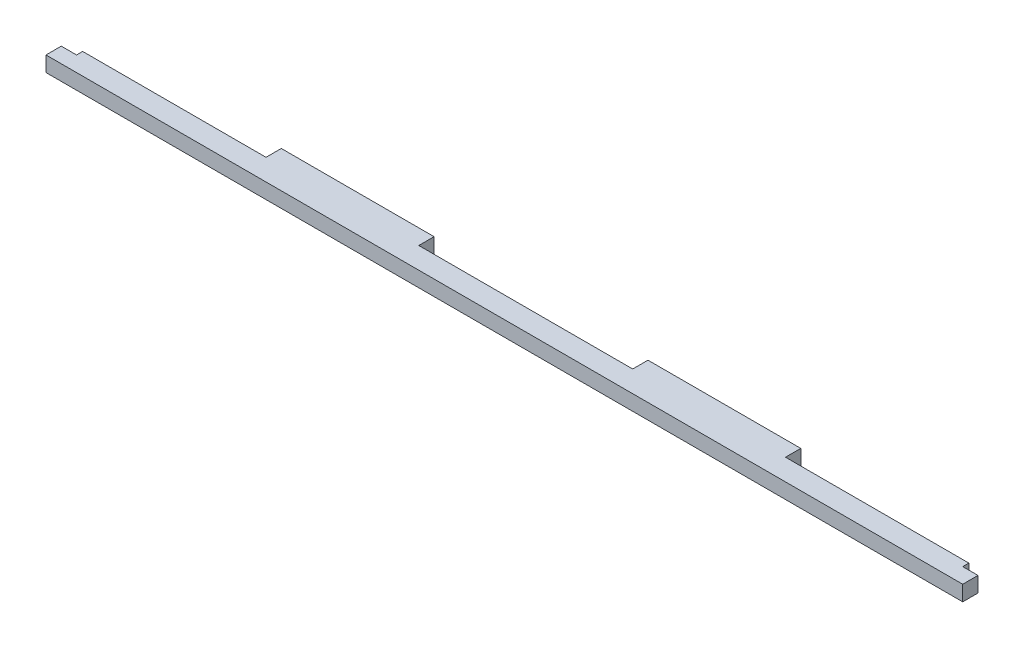
ISO-10303-21;
HEADER;
FILE_DESCRIPTION(('STEP AP214'),'2;1');
FILE_NAME('part.step','',(''),(''),'','','');
FILE_SCHEMA(('AUTOMOTIVE_DESIGN { 1 0 10303 214 1 1 1 1 }'));
ENDSEC;
DATA;
#1=APPLICATION_CONTEXT('core data for automotive mechanical design processes');
#2=APPLICATION_PROTOCOL_DEFINITION('international standard','automotive_design',2000,#1);
#3=PRODUCT_CONTEXT('',#1,'mechanical');
#4=PRODUCT('Part','Part','',(#3));
#5=PRODUCT_RELATED_PRODUCT_CATEGORY('part','',(#4));
#6=PRODUCT_DEFINITION_FORMATION('','',#4);
#7=PRODUCT_DEFINITION_CONTEXT('part definition',#1,'design');
#8=PRODUCT_DEFINITION('design','',#6,#7);
#9=PRODUCT_DEFINITION_SHAPE('','',#8);
#10=(LENGTH_UNIT() NAMED_UNIT(*) SI_UNIT(.MILLI.,.METRE.));
#11=(NAMED_UNIT(*) PLANE_ANGLE_UNIT() SI_UNIT($,.RADIAN.));
#12=(NAMED_UNIT(*) SI_UNIT($,.STERADIAN.) SOLID_ANGLE_UNIT());
#13=UNCERTAINTY_MEASURE_WITH_UNIT(LENGTH_MEASURE(1.E-05),#10,'distance_accuracy_value','');
#14=(GEOMETRIC_REPRESENTATION_CONTEXT(3) GLOBAL_UNCERTAINTY_ASSIGNED_CONTEXT((#13)) GLOBAL_UNIT_ASSIGNED_CONTEXT((#10,
#11,#12)) REPRESENTATION_CONTEXT('',''));
#15=CARTESIAN_POINT('',(0.,0.,0.));
#16=DIRECTION('',(0.,0.,1.));
#17=DIRECTION('',(1.,0.,0.));
#18=AXIS2_PLACEMENT_3D('',#15,#16,#17);
#19=CARTESIAN_POINT('',(0.,5.,0.));
#20=DIRECTION('',(1.,0.,0.));
#21=DIRECTION('',(0.,0.,-1.));
#22=AXIS2_PLACEMENT_3D('',#19,#20,#21);
#23=PLANE('',#22);
#24=DIRECTION('',(0.,0.,1.));
#25=VECTOR('',#24,1.);
#26=CARTESIAN_POINT('',(0.,0.,0.));
#27=LINE('',#26,#25);
#28=CARTESIAN_POINT('',(0.,0.,-5.));
#29=VERTEX_POINT('',#28);
#30=CARTESIAN_POINT('',(0.,0.,0.));
#31=VERTEX_POINT('',#30);
#32=EDGE_CURVE('E181',#29,#31,#27,.T.);
#33=ORIENTED_EDGE('',*,*,#32,.T.);
#34=DIRECTION('',(0.,-1.,0.));
#35=VECTOR('',#34,1.);
#36=CARTESIAN_POINT('',(0.,5.,0.));
#37=LINE('',#36,#35);
#38=CARTESIAN_POINT('',(0.,5.,0.));
#39=VERTEX_POINT('',#38);
#40=EDGE_CURVE('E11',#39,#31,#37,.T.);
#41=ORIENTED_EDGE('',*,*,#40,.F.);
#42=DIRECTION('',(0.,0.,1.));
#43=VECTOR('',#42,1.);
#44=CARTESIAN_POINT('',(0.,5.,0.));
#45=LINE('',#44,#43);
#46=CARTESIAN_POINT('',(0.,5.,-5.));
#47=VERTEX_POINT('',#46);
#48=EDGE_CURVE('E211',#47,#39,#45,.T.);
#49=ORIENTED_EDGE('',*,*,#48,.F.);
#50=DIRECTION('',(0.,-1.,0.));
#51=VECTOR('',#50,1.);
#52=CARTESIAN_POINT('',(0.,5.,-5.));
#53=LINE('',#52,#51);
#54=EDGE_CURVE('E177',#47,#29,#53,.T.);
#55=ORIENTED_EDGE('',*,*,#54,.T.);
#56=EDGE_LOOP('',(#33,#41,#49,#55));
#57=FACE_BOUND('',#56,.T.);
#58=ADVANCED_FACE('F37',(#57),#23,.F.);
#59=CARTESIAN_POINT('',(0.,5.,0.));
#60=DIRECTION('',(0.,0.,-1.));
#61=DIRECTION('',(-1.,0.,0.));
#62=AXIS2_PLACEMENT_3D('',#59,#60,#61);
#63=PLANE('',#62);
#64=DIRECTION('',(1.,0.,0.));
#65=VECTOR('',#64,1.);
#66=CARTESIAN_POINT('',(0.,0.,0.));
#67=LINE('',#66,#65);
#68=CARTESIAN_POINT('',(300.,0.,0.));
#69=VERTEX_POINT('',#68);
#70=EDGE_CURVE('E184',#31,#69,#67,.T.);
#71=ORIENTED_EDGE('',*,*,#70,.T.);
#72=DIRECTION('',(0.,-1.,0.));
#73=VECTOR('',#72,1.);
#74=CARTESIAN_POINT('',(300.,5.,0.));
#75=LINE('',#74,#73);
#76=CARTESIAN_POINT('',(300.,5.,0.));
#77=VERTEX_POINT('',#76);
#78=EDGE_CURVE('E45',#77,#69,#75,.T.);
#79=ORIENTED_EDGE('',*,*,#78,.F.);
#80=DIRECTION('',(1.,0.,0.));
#81=VECTOR('',#80,1.);
#82=CARTESIAN_POINT('',(0.,5.,0.));
#83=LINE('',#82,#81);
#84=EDGE_CURVE('E120',#39,#77,#83,.T.);
#85=ORIENTED_EDGE('',*,*,#84,.F.);
#86=ORIENTED_EDGE('',*,*,#40,.T.);
#87=EDGE_LOOP('',(#71,#79,#85,#86));
#88=FACE_BOUND('',#87,.T.);
#89=ADVANCED_FACE('F309',(#88),#63,.F.);
#90=CARTESIAN_POINT('',(300.,5.,0.));
#91=DIRECTION('',(-1.,0.,0.));
#92=DIRECTION('',(0.,0.,1.));
#93=AXIS2_PLACEMENT_3D('',#90,#91,#92);
#94=PLANE('',#93);
#95=DIRECTION('',(0.,0.,-1.));
#96=VECTOR('',#95,1.);
#97=CARTESIAN_POINT('',(300.,0.,0.));
#98=LINE('',#97,#96);
#99=CARTESIAN_POINT('',(300.,0.,-5.));
#100=VERTEX_POINT('',#99);
#101=EDGE_CURVE('E186',#69,#100,#98,.T.);
#102=ORIENTED_EDGE('',*,*,#101,.T.);
#103=DIRECTION('',(0.,-1.,0.));
#104=VECTOR('',#103,1.);
#105=CARTESIAN_POINT('',(300.,5.,-5.));
#106=LINE('',#105,#104);
#107=CARTESIAN_POINT('',(300.,5.,-5.));
#108=VERTEX_POINT('',#107);
#109=EDGE_CURVE('E242',#108,#100,#106,.T.);
#110=ORIENTED_EDGE('',*,*,#109,.F.);
#111=DIRECTION('',(0.,0.,-1.));
#112=VECTOR('',#111,1.);
#113=CARTESIAN_POINT('',(300.,5.,0.));
#114=LINE('',#113,#112);
#115=EDGE_CURVE('E250',#77,#108,#114,.T.);
#116=ORIENTED_EDGE('',*,*,#115,.F.);
#117=ORIENTED_EDGE('',*,*,#78,.T.);
#118=EDGE_LOOP('',(#102,#110,#116,#117));
#119=FACE_BOUND('',#118,.T.);
#120=ADVANCED_FACE('F248',(#119),#94,.F.);
#121=CARTESIAN_POINT('',(295.,5.,-5.));
#122=DIRECTION('',(0.,0.,1.));
#123=DIRECTION('',(1.,0.,0.));
#124=AXIS2_PLACEMENT_3D('',#121,#122,#123);
#125=PLANE('',#124);
#126=DIRECTION('',(-1.,0.,0.));
#127=VECTOR('',#126,1.);
#128=CARTESIAN_POINT('',(295.,0.,-5.));
#129=LINE('',#128,#127);
#130=CARTESIAN_POINT('',(295.,0.,-5.));
#131=VERTEX_POINT('',#130);
#132=EDGE_CURVE('E188',#100,#131,#129,.T.);
#133=ORIENTED_EDGE('',*,*,#132,.T.);
#134=DIRECTION('',(0.,-1.,0.));
#135=VECTOR('',#134,1.);
#136=CARTESIAN_POINT('',(295.,5.,-5.));
#137=LINE('',#136,#135);
#138=CARTESIAN_POINT('',(295.,5.,-5.));
#139=VERTEX_POINT('',#138);
#140=EDGE_CURVE('E239',#139,#131,#137,.T.);
#141=ORIENTED_EDGE('',*,*,#140,.F.);
#142=DIRECTION('',(-1.,0.,0.));
#143=VECTOR('',#142,1.);
#144=CARTESIAN_POINT('',(295.,5.,-5.));
#145=LINE('',#144,#143);
#146=EDGE_CURVE('E268',#108,#139,#145,.T.);
#147=ORIENTED_EDGE('',*,*,#146,.F.);
#148=ORIENTED_EDGE('',*,*,#109,.T.);
#149=EDGE_LOOP('',(#133,#141,#147,#148));
#150=FACE_BOUND('',#149,.T.);
#151=ADVANCED_FACE('F259',(#150),#125,.F.);
#152=CARTESIAN_POINT('',(295.,5.,-7.));
#153=DIRECTION('',(-1.,0.,0.));
#154=DIRECTION('',(0.,0.,1.));
#155=AXIS2_PLACEMENT_3D('',#152,#153,#154);
#156=PLANE('',#155);
#157=DIRECTION('',(0.,0.,-1.));
#158=VECTOR('',#157,1.);
#159=CARTESIAN_POINT('',(295.,0.,-7.));
#160=LINE('',#159,#158);
#161=CARTESIAN_POINT('',(295.,0.,-7.));
#162=VERTEX_POINT('',#161);
#163=EDGE_CURVE('E190',#131,#162,#160,.T.);
#164=ORIENTED_EDGE('',*,*,#163,.T.);
#165=DIRECTION('',(0.,-1.,0.));
#166=VECTOR('',#165,1.);
#167=CARTESIAN_POINT('',(295.,5.,-7.));
#168=LINE('',#167,#166);
#169=CARTESIAN_POINT('',(295.,5.,-7.));
#170=VERTEX_POINT('',#169);
#171=EDGE_CURVE('E236',#170,#162,#168,.T.);
#172=ORIENTED_EDGE('',*,*,#171,.F.);
#173=DIRECTION('',(0.,0.,-1.));
#174=VECTOR('',#173,1.);
#175=CARTESIAN_POINT('',(295.,5.,-7.));
#176=LINE('',#175,#174);
#177=EDGE_CURVE('E265',#139,#170,#176,.T.);
#178=ORIENTED_EDGE('',*,*,#177,.F.);
#179=ORIENTED_EDGE('',*,*,#140,.T.);
#180=EDGE_LOOP('',(#164,#172,#178,#179));
#181=FACE_BOUND('',#180,.T.);
#182=ADVANCED_FACE('F263',(#181),#156,.F.);
#183=CARTESIAN_POINT('',(235.,5.,-7.));
#184=DIRECTION('',(0.,0.,1.));
#185=DIRECTION('',(1.,0.,0.));
#186=AXIS2_PLACEMENT_3D('',#183,#184,#185);
#187=PLANE('',#186);
#188=DIRECTION('',(-1.,0.,0.));
#189=VECTOR('',#188,1.);
#190=CARTESIAN_POINT('',(235.,0.,-7.));
#191=LINE('',#190,#189);
#192=CARTESIAN_POINT('',(235.,0.,-7.));
#193=VERTEX_POINT('',#192);
#194=EDGE_CURVE('E192',#162,#193,#191,.T.);
#195=ORIENTED_EDGE('',*,*,#194,.T.);
#196=DIRECTION('',(0.,-1.,0.));
#197=VECTOR('',#196,1.);
#198=CARTESIAN_POINT('',(235.,5.,-7.));
#199=LINE('',#198,#197);
#200=CARTESIAN_POINT('',(235.,5.,-7.));
#201=VERTEX_POINT('',#200);
#202=EDGE_CURVE('E233',#201,#193,#199,.T.);
#203=ORIENTED_EDGE('',*,*,#202,.F.);
#204=DIRECTION('',(-1.,0.,0.));
#205=VECTOR('',#204,1.);
#206=CARTESIAN_POINT('',(235.,5.,-7.));
#207=LINE('',#206,#205);
#208=EDGE_CURVE('E267',#170,#201,#207,.T.);
#209=ORIENTED_EDGE('',*,*,#208,.F.);
#210=ORIENTED_EDGE('',*,*,#171,.T.);
#211=EDGE_LOOP('',(#195,#203,#209,#210));
#212=FACE_BOUND('',#211,.T.);
#213=ADVANCED_FACE('F322',(#212),#187,.F.);
#214=CARTESIAN_POINT('',(235.,5.,-7.));
#215=DIRECTION('',(-1.,0.,0.));
#216=DIRECTION('',(0.,0.,1.));
#217=AXIS2_PLACEMENT_3D('',#214,#215,#216);
#218=PLANE('',#217);
#219=DIRECTION('',(0.,0.,-1.));
#220=VECTOR('',#219,1.);
#221=CARTESIAN_POINT('',(235.,0.,-7.));
#222=LINE('',#221,#220);
#223=CARTESIAN_POINT('',(235.,0.,-12.));
#224=VERTEX_POINT('',#223);
#225=EDGE_CURVE('E194',#193,#224,#222,.T.);
#226=ORIENTED_EDGE('',*,*,#225,.T.);
#227=DIRECTION('',(0.,-1.,0.));
#228=VECTOR('',#227,1.);
#229=CARTESIAN_POINT('',(235.,5.,-12.));
#230=LINE('',#229,#228);
#231=CARTESIAN_POINT('',(235.,5.,-12.));
#232=VERTEX_POINT('',#231);
#233=EDGE_CURVE('E230',#232,#224,#230,.T.);
#234=ORIENTED_EDGE('',*,*,#233,.F.);
#235=DIRECTION('',(0.,0.,-1.));
#236=VECTOR('',#235,1.);
#237=CARTESIAN_POINT('',(235.,5.,-7.));
#238=LINE('',#237,#236);
#239=EDGE_CURVE('E270',#201,#232,#238,.T.);
#240=ORIENTED_EDGE('',*,*,#239,.F.);
#241=ORIENTED_EDGE('',*,*,#202,.T.);
#242=EDGE_LOOP('',(#226,#234,#240,#241));
#243=FACE_BOUND('',#242,.T.);
#244=ADVANCED_FACE('F325',(#243),#218,.F.);
#245=CARTESIAN_POINT('',(185.,5.,-12.));
#246=DIRECTION('',(0.,0.,1.));
#247=DIRECTION('',(1.,0.,0.));
#248=AXIS2_PLACEMENT_3D('',#245,#246,#247);
#249=PLANE('',#248);
#250=DIRECTION('',(-1.,0.,0.));
#251=VECTOR('',#250,1.);
#252=CARTESIAN_POINT('',(185.,0.,-12.));
#253=LINE('',#252,#251);
#254=CARTESIAN_POINT('',(185.,0.,-12.));
#255=VERTEX_POINT('',#254);
#256=EDGE_CURVE('E196',#224,#255,#253,.T.);
#257=ORIENTED_EDGE('',*,*,#256,.T.);
#258=DIRECTION('',(0.,-1.,0.));
#259=VECTOR('',#258,1.);
#260=CARTESIAN_POINT('',(185.,5.,-12.));
#261=LINE('',#260,#259);
#262=CARTESIAN_POINT('',(185.,5.,-12.));
#263=VERTEX_POINT('',#262);
#264=EDGE_CURVE('E227',#263,#255,#261,.T.);
#265=ORIENTED_EDGE('',*,*,#264,.F.);
#266=DIRECTION('',(-1.,0.,0.));
#267=VECTOR('',#266,1.);
#268=CARTESIAN_POINT('',(185.,5.,-12.));
#269=LINE('',#268,#267);
#270=EDGE_CURVE('E276',#232,#263,#269,.T.);
#271=ORIENTED_EDGE('',*,*,#270,.F.);
#272=ORIENTED_EDGE('',*,*,#233,.T.);
#273=EDGE_LOOP('',(#257,#265,#271,#272));
#274=FACE_BOUND('',#273,.T.);
#275=ADVANCED_FACE('F329',(#274),#249,.F.);
#276=CARTESIAN_POINT('',(185.,5.,-7.));
#277=DIRECTION('',(1.,0.,0.));
#278=DIRECTION('',(0.,0.,-1.));
#279=AXIS2_PLACEMENT_3D('',#276,#277,#278);
#280=PLANE('',#279);
#281=DIRECTION('',(0.,0.,1.));
#282=VECTOR('',#281,1.);
#283=CARTESIAN_POINT('',(185.,0.,-7.));
#284=LINE('',#283,#282);
#285=CARTESIAN_POINT('',(185.,0.,-7.));
#286=VERTEX_POINT('',#285);
#287=EDGE_CURVE('E198',#255,#286,#284,.T.);
#288=ORIENTED_EDGE('',*,*,#287,.T.);
#289=DIRECTION('',(0.,-1.,0.));
#290=VECTOR('',#289,1.);
#291=CARTESIAN_POINT('',(185.,5.,-7.));
#292=LINE('',#291,#290);
#293=CARTESIAN_POINT('',(185.,5.,-7.));
#294=VERTEX_POINT('',#293);
#295=EDGE_CURVE('E224',#294,#286,#292,.T.);
#296=ORIENTED_EDGE('',*,*,#295,.F.);
#297=DIRECTION('',(0.,0.,1.));
#298=VECTOR('',#297,1.);
#299=CARTESIAN_POINT('',(185.,5.,-7.));
#300=LINE('',#299,#298);
#301=EDGE_CURVE('E278',#263,#294,#300,.T.);
#302=ORIENTED_EDGE('',*,*,#301,.F.);
#303=ORIENTED_EDGE('',*,*,#264,.T.);
#304=EDGE_LOOP('',(#288,#296,#302,#303));
#305=FACE_BOUND('',#304,.T.);
#306=ADVANCED_FACE('F333',(#305),#280,.F.);
#307=CARTESIAN_POINT('',(115.,5.,-7.));
#308=DIRECTION('',(0.,0.,1.));
#309=DIRECTION('',(1.,0.,0.));
#310=AXIS2_PLACEMENT_3D('',#307,#308,#309);
#311=PLANE('',#310);
#312=DIRECTION('',(-1.,0.,0.));
#313=VECTOR('',#312,1.);
#314=CARTESIAN_POINT('',(115.,0.,-7.));
#315=LINE('',#314,#313);
#316=CARTESIAN_POINT('',(115.,0.,-7.));
#317=VERTEX_POINT('',#316);
#318=EDGE_CURVE('E200',#286,#317,#315,.T.);
#319=ORIENTED_EDGE('',*,*,#318,.T.);
#320=DIRECTION('',(0.,-1.,0.));
#321=VECTOR('',#320,1.);
#322=CARTESIAN_POINT('',(115.,5.,-7.));
#323=LINE('',#322,#321);
#324=CARTESIAN_POINT('',(115.,5.,-7.));
#325=VERTEX_POINT('',#324);
#326=EDGE_CURVE('E221',#325,#317,#323,.T.);
#327=ORIENTED_EDGE('',*,*,#326,.F.);
#328=DIRECTION('',(-1.,0.,0.));
#329=VECTOR('',#328,1.);
#330=CARTESIAN_POINT('',(115.,5.,-7.));
#331=LINE('',#330,#329);
#332=EDGE_CURVE('E280',#294,#325,#331,.T.);
#333=ORIENTED_EDGE('',*,*,#332,.F.);
#334=ORIENTED_EDGE('',*,*,#295,.T.);
#335=EDGE_LOOP('',(#319,#327,#333,#334));
#336=FACE_BOUND('',#335,.T.);
#337=ADVANCED_FACE('F337',(#336),#311,.F.);
#338=CARTESIAN_POINT('',(115.,5.,-7.));
#339=DIRECTION('',(-1.,0.,0.));
#340=DIRECTION('',(0.,0.,1.));
#341=AXIS2_PLACEMENT_3D('',#338,#339,#340);
#342=PLANE('',#341);
#343=DIRECTION('',(0.,0.,-1.));
#344=VECTOR('',#343,1.);
#345=CARTESIAN_POINT('',(115.,0.,-7.));
#346=LINE('',#345,#344);
#347=CARTESIAN_POINT('',(115.,0.,-12.));
#348=VERTEX_POINT('',#347);
#349=EDGE_CURVE('E202',#317,#348,#346,.T.);
#350=ORIENTED_EDGE('',*,*,#349,.T.);
#351=DIRECTION('',(0.,-1.,0.));
#352=VECTOR('',#351,1.);
#353=CARTESIAN_POINT('',(115.,5.,-12.));
#354=LINE('',#353,#352);
#355=CARTESIAN_POINT('',(115.,5.,-12.));
#356=VERTEX_POINT('',#355);
#357=EDGE_CURVE('E218',#356,#348,#354,.T.);
#358=ORIENTED_EDGE('',*,*,#357,.F.);
#359=DIRECTION('',(0.,0.,-1.));
#360=VECTOR('',#359,1.);
#361=CARTESIAN_POINT('',(115.,5.,-7.));
#362=LINE('',#361,#360);
#363=EDGE_CURVE('E282',#325,#356,#362,.T.);
#364=ORIENTED_EDGE('',*,*,#363,.F.);
#365=ORIENTED_EDGE('',*,*,#326,.T.);
#366=EDGE_LOOP('',(#350,#358,#364,#365));
#367=FACE_BOUND('',#366,.T.);
#368=ADVANCED_FACE('F341',(#367),#342,.F.);
#369=CARTESIAN_POINT('',(65.,5.,-12.));
#370=DIRECTION('',(0.,0.,1.));
#371=DIRECTION('',(1.,0.,0.));
#372=AXIS2_PLACEMENT_3D('',#369,#370,#371);
#373=PLANE('',#372);
#374=DIRECTION('',(-1.,0.,0.));
#375=VECTOR('',#374,1.);
#376=CARTESIAN_POINT('',(65.,0.,-12.));
#377=LINE('',#376,#375);
#378=CARTESIAN_POINT('',(65.,0.,-12.));
#379=VERTEX_POINT('',#378);
#380=EDGE_CURVE('E204',#348,#379,#377,.T.);
#381=ORIENTED_EDGE('',*,*,#380,.T.);
#382=DIRECTION('',(0.,-1.,0.));
#383=VECTOR('',#382,1.);
#384=CARTESIAN_POINT('',(65.,5.,-12.));
#385=LINE('',#384,#383);
#386=CARTESIAN_POINT('',(65.,5.,-12.));
#387=VERTEX_POINT('',#386);
#388=EDGE_CURVE('E215',#387,#379,#385,.T.);
#389=ORIENTED_EDGE('',*,*,#388,.F.);
#390=DIRECTION('',(-1.,0.,0.));
#391=VECTOR('',#390,1.);
#392=CARTESIAN_POINT('',(65.,5.,-12.));
#393=LINE('',#392,#391);
#394=EDGE_CURVE('E284',#356,#387,#393,.T.);
#395=ORIENTED_EDGE('',*,*,#394,.F.);
#396=ORIENTED_EDGE('',*,*,#357,.T.);
#397=EDGE_LOOP('',(#381,#389,#395,#396));
#398=FACE_BOUND('',#397,.T.);
#399=ADVANCED_FACE('F290',(#398),#373,.F.);
#400=CARTESIAN_POINT('',(65.,5.,-7.));
#401=DIRECTION('',(1.,0.,0.));
#402=DIRECTION('',(0.,0.,-1.));
#403=AXIS2_PLACEMENT_3D('',#400,#401,#402);
#404=PLANE('',#403);
#405=DIRECTION('',(0.,0.,1.));
#406=VECTOR('',#405,1.);
#407=CARTESIAN_POINT('',(65.,0.,-7.));
#408=LINE('',#407,#406);
#409=CARTESIAN_POINT('',(65.,0.,-7.));
#410=VERTEX_POINT('',#409);
#411=EDGE_CURVE('E206',#379,#410,#408,.T.);
#412=ORIENTED_EDGE('',*,*,#411,.T.);
#413=DIRECTION('',(0.,-1.,0.));
#414=VECTOR('',#413,1.);
#415=CARTESIAN_POINT('',(65.,5.,-7.));
#416=LINE('',#415,#414);
#417=CARTESIAN_POINT('',(65.,5.,-7.));
#418=VERTEX_POINT('',#417);
#419=EDGE_CURVE('E172',#418,#410,#416,.T.);
#420=ORIENTED_EDGE('',*,*,#419,.F.);
#421=DIRECTION('',(0.,0.,1.));
#422=VECTOR('',#421,1.);
#423=CARTESIAN_POINT('',(65.,5.,-7.));
#424=LINE('',#423,#422);
#425=EDGE_CURVE('E163',#387,#418,#424,.T.);
#426=ORIENTED_EDGE('',*,*,#425,.F.);
#427=ORIENTED_EDGE('',*,*,#388,.T.);
#428=EDGE_LOOP('',(#412,#420,#426,#427));
#429=FACE_BOUND('',#428,.T.);
#430=ADVANCED_FACE('F294',(#429),#404,.F.);
#431=CARTESIAN_POINT('',(5.,5.,-7.));
#432=DIRECTION('',(0.,0.,1.));
#433=DIRECTION('',(1.,0.,0.));
#434=AXIS2_PLACEMENT_3D('',#431,#432,#433);
#435=PLANE('',#434);
#436=DIRECTION('',(-1.,0.,0.));
#437=VECTOR('',#436,1.);
#438=CARTESIAN_POINT('',(5.,0.,-7.));
#439=LINE('',#438,#437);
#440=CARTESIAN_POINT('',(5.,0.,-7.));
#441=VERTEX_POINT('',#440);
#442=EDGE_CURVE('E171',#410,#441,#439,.T.);
#443=ORIENTED_EDGE('',*,*,#442,.T.);
#444=DIRECTION('',(0.,-1.,0.));
#445=VECTOR('',#444,1.);
#446=CARTESIAN_POINT('',(5.,5.,-7.));
#447=LINE('',#446,#445);
#448=CARTESIAN_POINT('',(5.,5.,-7.));
#449=VERTEX_POINT('',#448);
#450=EDGE_CURVE('E168',#449,#441,#447,.T.);
#451=ORIENTED_EDGE('',*,*,#450,.F.);
#452=DIRECTION('',(-1.,0.,0.));
#453=VECTOR('',#452,1.);
#454=CARTESIAN_POINT('',(5.,5.,-7.));
#455=LINE('',#454,#453);
#456=EDGE_CURVE('E157',#418,#449,#455,.T.);
#457=ORIENTED_EDGE('',*,*,#456,.F.);
#458=ORIENTED_EDGE('',*,*,#419,.T.);
#459=EDGE_LOOP('',(#443,#451,#457,#458));
#460=FACE_BOUND('',#459,.T.);
#461=ADVANCED_FACE('F169',(#460),#435,.F.);
#462=CARTESIAN_POINT('',(5.,5.,-5.));
#463=DIRECTION('',(1.,0.,0.));
#464=DIRECTION('',(0.,0.,-1.));
#465=AXIS2_PLACEMENT_3D('',#462,#463,#464);
#466=PLANE('',#465);
#467=DIRECTION('',(0.,0.,1.));
#468=VECTOR('',#467,1.);
#469=CARTESIAN_POINT('',(5.,0.,-5.));
#470=LINE('',#469,#468);
#471=CARTESIAN_POINT('',(5.,0.,-5.));
#472=VERTEX_POINT('',#471);
#473=EDGE_CURVE('E106',#441,#472,#470,.T.);
#474=ORIENTED_EDGE('',*,*,#473,.T.);
#475=DIRECTION('',(0.,-1.,0.));
#476=VECTOR('',#475,1.);
#477=CARTESIAN_POINT('',(5.,5.,-5.));
#478=LINE('',#477,#476);
#479=CARTESIAN_POINT('',(5.,5.,-5.));
#480=VERTEX_POINT('',#479);
#481=EDGE_CURVE('E173',#480,#472,#478,.T.);
#482=ORIENTED_EDGE('',*,*,#481,.F.);
#483=DIRECTION('',(0.,0.,1.));
#484=VECTOR('',#483,1.);
#485=CARTESIAN_POINT('',(5.,5.,-5.));
#486=LINE('',#485,#484);
#487=EDGE_CURVE('E161',#449,#480,#486,.T.);
#488=ORIENTED_EDGE('',*,*,#487,.F.);
#489=ORIENTED_EDGE('',*,*,#450,.T.);
#490=EDGE_LOOP('',(#474,#482,#488,#489));
#491=FACE_BOUND('',#490,.T.);
#492=ADVANCED_FACE('F175',(#491),#466,.F.);
#493=CARTESIAN_POINT('',(0.,5.,-5.));
#494=DIRECTION('',(0.,0.,1.));
#495=DIRECTION('',(1.,0.,0.));
#496=AXIS2_PLACEMENT_3D('',#493,#494,#495);
#497=PLANE('',#496);
#498=DIRECTION('',(-1.,0.,0.));
#499=VECTOR('',#498,1.);
#500=CARTESIAN_POINT('',(0.,0.,-5.));
#501=LINE('',#500,#499);
#502=EDGE_CURVE('E112',#472,#29,#501,.T.);
#503=ORIENTED_EDGE('',*,*,#502,.T.);
#504=ORIENTED_EDGE('',*,*,#54,.F.);
#505=DIRECTION('',(-1.,0.,0.));
#506=VECTOR('',#505,1.);
#507=CARTESIAN_POINT('',(0.,5.,-5.));
#508=LINE('',#507,#506);
#509=EDGE_CURVE('E53',#480,#47,#508,.T.);
#510=ORIENTED_EDGE('',*,*,#509,.F.);
#511=ORIENTED_EDGE('',*,*,#481,.T.);
#512=EDGE_LOOP('',(#503,#504,#510,#511));
#513=FACE_BOUND('',#512,.T.);
#514=ADVANCED_FACE('F298',(#513),#497,.F.);
#515=CARTESIAN_POINT('',(0.,5.,0.));
#516=DIRECTION('',(0.,-1.,0.));
#517=DIRECTION('',(0.,0.,-1.));
#518=AXIS2_PLACEMENT_3D('',#515,#516,#517);
#519=PLANE('',#518);
#520=ORIENTED_EDGE('',*,*,#48,.T.);
#521=ORIENTED_EDGE('',*,*,#84,.T.);
#522=ORIENTED_EDGE('',*,*,#115,.T.);
#523=ORIENTED_EDGE('',*,*,#146,.T.);
#524=ORIENTED_EDGE('',*,*,#177,.T.);
#525=ORIENTED_EDGE('',*,*,#208,.T.);
#526=ORIENTED_EDGE('',*,*,#239,.T.);
#527=ORIENTED_EDGE('',*,*,#270,.T.);
#528=ORIENTED_EDGE('',*,*,#301,.T.);
#529=ORIENTED_EDGE('',*,*,#332,.T.);
#530=ORIENTED_EDGE('',*,*,#363,.T.);
#531=ORIENTED_EDGE('',*,*,#394,.T.);
#532=ORIENTED_EDGE('',*,*,#425,.T.);
#533=ORIENTED_EDGE('',*,*,#456,.T.);
#534=ORIENTED_EDGE('',*,*,#487,.T.);
#535=ORIENTED_EDGE('',*,*,#509,.T.);
#536=EDGE_LOOP('',(#520,#521,#522,#523,#524,#525,#526,#527,#528,#529,#530,#531,#532,#533,#534,#535));
#537=FACE_BOUND('',#536,.T.);
#538=ADVANCED_FACE('F159',(#537),#519,.F.);
#539=CARTESIAN_POINT('',(0.,0.,0.));
#540=DIRECTION('',(0.,-1.,0.));
#541=DIRECTION('',(0.,0.,-1.));
#542=AXIS2_PLACEMENT_3D('',#539,#540,#541);
#543=PLANE('',#542);
#544=ORIENTED_EDGE('',*,*,#32,.F.);
#545=ORIENTED_EDGE('',*,*,#502,.F.);
#546=ORIENTED_EDGE('',*,*,#473,.F.);
#547=ORIENTED_EDGE('',*,*,#442,.F.);
#548=ORIENTED_EDGE('',*,*,#411,.F.);
#549=ORIENTED_EDGE('',*,*,#380,.F.);
#550=ORIENTED_EDGE('',*,*,#349,.F.);
#551=ORIENTED_EDGE('',*,*,#318,.F.);
#552=ORIENTED_EDGE('',*,*,#287,.F.);
#553=ORIENTED_EDGE('',*,*,#256,.F.);
#554=ORIENTED_EDGE('',*,*,#225,.F.);
#555=ORIENTED_EDGE('',*,*,#194,.F.);
#556=ORIENTED_EDGE('',*,*,#163,.F.);
#557=ORIENTED_EDGE('',*,*,#132,.F.);
#558=ORIENTED_EDGE('',*,*,#101,.F.);
#559=ORIENTED_EDGE('',*,*,#70,.F.);
#560=EDGE_LOOP('',(#544,#545,#546,#547,#548,#549,#550,#551,#552,#553,#554,#555,#556,#557,#558,#559));
#561=FACE_BOUND('',#560,.T.);
#562=ADVANCED_FACE('F254',(#561),#543,.T.);
#563=CLOSED_SHELL('',(#58,#89,#120,#151,#182,#213,#244,#275,#306,#337,#368,#399,#430,#461,#492,
#514,#538,#562));
#564=MANIFOLD_SOLID_BREP('B2',#563);
#565=ADVANCED_BREP_SHAPE_REPRESENTATION('',(#18,#564),#14);
#566=SHAPE_DEFINITION_REPRESENTATION(#9,#565);
ENDSEC;
END-ISO-10303-21;
